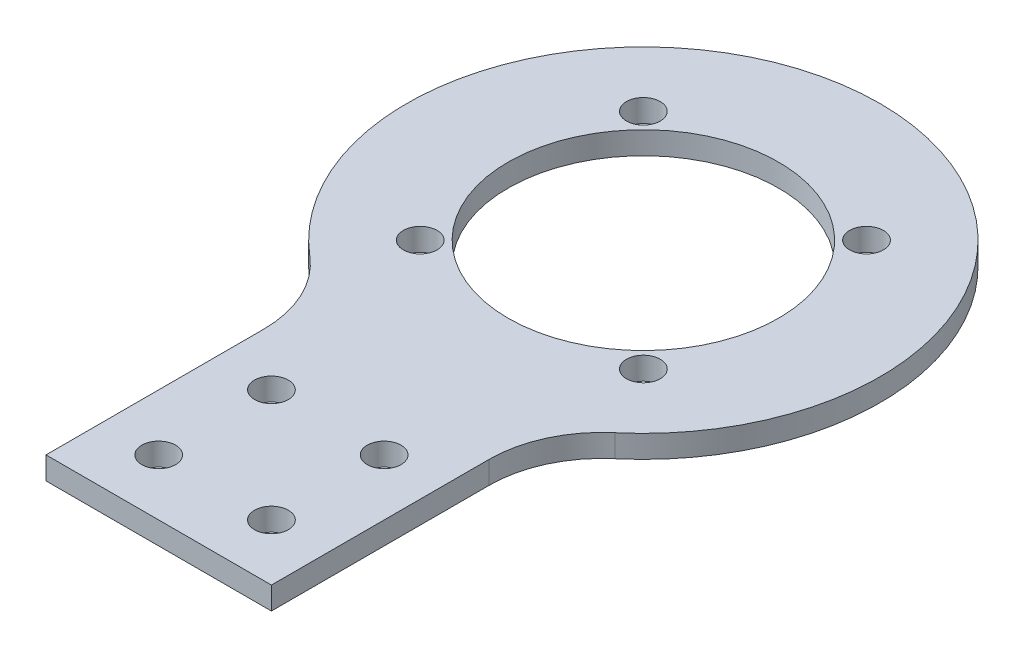
ISO-10303-21;
HEADER;
FILE_DESCRIPTION(('STEP AP214'),'2;1');
FILE_NAME('part.step','',(''),(''),'','','');
FILE_SCHEMA(('AUTOMOTIVE_DESIGN { 1 0 10303 214 1 1 1 1 }'));
ENDSEC;
DATA;
#1=APPLICATION_CONTEXT('core data for automotive mechanical design processes');
#2=APPLICATION_PROTOCOL_DEFINITION('international standard','automotive_design',2000,#1);
#3=PRODUCT_CONTEXT('',#1,'mechanical');
#4=PRODUCT('Part','Part','',(#3));
#5=PRODUCT_RELATED_PRODUCT_CATEGORY('part','',(#4));
#6=PRODUCT_DEFINITION_FORMATION('','',#4);
#7=PRODUCT_DEFINITION_CONTEXT('part definition',#1,'design');
#8=PRODUCT_DEFINITION('design','',#6,#7);
#9=PRODUCT_DEFINITION_SHAPE('','',#8);
#10=(LENGTH_UNIT() NAMED_UNIT(*) SI_UNIT(.MILLI.,.METRE.));
#11=(NAMED_UNIT(*) PLANE_ANGLE_UNIT() SI_UNIT($,.RADIAN.));
#12=(NAMED_UNIT(*) SI_UNIT($,.STERADIAN.) SOLID_ANGLE_UNIT());
#13=UNCERTAINTY_MEASURE_WITH_UNIT(LENGTH_MEASURE(1.E-05),#10,'distance_accuracy_value','');
#14=(GEOMETRIC_REPRESENTATION_CONTEXT(3) GLOBAL_UNCERTAINTY_ASSIGNED_CONTEXT((#13)) GLOBAL_UNIT_ASSIGNED_CONTEXT((#10,
#11,#12)) REPRESENTATION_CONTEXT('',''));
#15=CARTESIAN_POINT('',(0.,0.,0.));
#16=DIRECTION('',(0.,0.,1.));
#17=DIRECTION('',(1.,0.,0.));
#18=AXIS2_PLACEMENT_3D('',#15,#16,#17);
#19=CARTESIAN_POINT('',(0.,2.,0.));
#20=DIRECTION('',(0.,1.,0.));
#21=DIRECTION('',(0.,0.,1.));
#22=AXIS2_PLACEMENT_3D('',#19,#20,#21);
#23=PLANE('',#22);
#24=DIRECTION('',(0.,0.,-1.));
#25=VECTOR('',#24,1.);
#26=CARTESIAN_POINT('',(10.,2.,18.));
#27=LINE('',#26,#25);
#28=CARTESIAN_POINT('',(10.,2.,43.));
#29=VERTEX_POINT('',#28);
#30=CARTESIAN_POINT('',(10.,2.,23.685438564654));
#31=VERTEX_POINT('',#30);
#32=EDGE_CURVE('E104',#29,#31,#27,.T.);
#33=ORIENTED_EDGE('',*,*,#32,.T.);
#34=CARTESIAN_POINT('',(20.,2.,23.685438564654));
#35=DIRECTION('',(0.,1.,0.));
#36=DIRECTION('',(0.,0.,1.));
#37=AXIS2_PLACEMENT_3D('',#34,#35,#36);
#38=CIRCLE('',#37,10.);
#39=CARTESIAN_POINT('',(13.5483870967742,2.,16.0449745115398));
#40=VERTEX_POINT('',#39);
#41=EDGE_CURVE('E200',#31,#40,#38,.F.);
#42=ORIENTED_EDGE('',*,*,#41,.T.);
#43=CARTESIAN_POINT('',(0.,2.,0.));
#44=DIRECTION('',(0.,1.,0.));
#45=DIRECTION('',(0.,0.,1.));
#46=AXIS2_PLACEMENT_3D('',#43,#44,#45);
#47=CIRCLE('',#46,21.);
#48=CARTESIAN_POINT('',(-13.5483870967742,2.,16.0449745115398));
#49=VERTEX_POINT('',#48);
#50=EDGE_CURVE('E178',#40,#49,#47,.T.);
#51=ORIENTED_EDGE('',*,*,#50,.T.);
#52=CARTESIAN_POINT('',(-20.,2.,23.685438564654));
#53=DIRECTION('',(0.,1.,0.));
#54=DIRECTION('',(0.,0.,1.));
#55=AXIS2_PLACEMENT_3D('',#52,#53,#54);
#56=CIRCLE('',#55,10.);
#57=CARTESIAN_POINT('',(-10.,2.,23.685438564654));
#58=VERTEX_POINT('',#57);
#59=EDGE_CURVE('E53',#49,#58,#56,.F.);
#60=ORIENTED_EDGE('',*,*,#59,.T.);
#61=DIRECTION('',(0.,0.,1.));
#62=VECTOR('',#61,1.);
#63=CARTESIAN_POINT('',(-10.,2.,18.));
#64=LINE('',#63,#62);
#65=CARTESIAN_POINT('',(-10.,2.,43.));
#66=VERTEX_POINT('',#65);
#67=EDGE_CURVE('E126',#58,#66,#64,.T.);
#68=ORIENTED_EDGE('',*,*,#67,.T.);
#69=DIRECTION('',(1.,0.,0.));
#70=VECTOR('',#69,1.);
#71=CARTESIAN_POINT('',(-10.,2.,43.));
#72=LINE('',#71,#70);
#73=EDGE_CURVE('E111',#66,#29,#72,.T.);
#74=ORIENTED_EDGE('',*,*,#73,.T.);
#75=EDGE_LOOP('',(#33,#42,#51,#60,#68,#74));
#76=FACE_BOUND('',#75,.T.);
#77=CARTESIAN_POINT('',(-9.89949493661167,2.,9.89949493661167));
#78=DIRECTION('',(0.,1.,0.));
#79=DIRECTION('',(0.,0.,1.));
#80=AXIS2_PLACEMENT_3D('',#77,#78,#79);
#81=CIRCLE('',#80,1.5);
#82=CARTESIAN_POINT('',(-9.89949493661167,2.,11.3994949366117));
#83=VERTEX_POINT('',#82);
#84=EDGE_CURVE('E146',#83,#83,#81,.T.);
#85=ORIENTED_EDGE('',*,*,#84,.F.);
#86=EDGE_LOOP('',(#85));
#87=FACE_BOUND('',#86,.T.);
#88=CARTESIAN_POINT('',(9.89949493661167,2.,-9.89949493661167));
#89=DIRECTION('',(0.,1.,0.));
#90=DIRECTION('',(0.,0.,1.));
#91=AXIS2_PLACEMENT_3D('',#88,#89,#90);
#92=CIRCLE('',#91,1.5);
#93=CARTESIAN_POINT('',(9.89949493661167,2.,-8.39949493661167));
#94=VERTEX_POINT('',#93);
#95=EDGE_CURVE('E162',#94,#94,#92,.T.);
#96=ORIENTED_EDGE('',*,*,#95,.F.);
#97=EDGE_LOOP('',(#96));
#98=FACE_BOUND('',#97,.T.);
#99=CARTESIAN_POINT('',(0.,2.,0.));
#100=DIRECTION('',(0.,1.,0.));
#101=DIRECTION('',(0.,0.,1.));
#102=AXIS2_PLACEMENT_3D('',#99,#100,#101);
#103=CIRCLE('',#102,12.);
#104=CARTESIAN_POINT('',(0.,2.,12.));
#105=VERTEX_POINT('',#104);
#106=EDGE_CURVE('E170',#105,#105,#103,.T.);
#107=ORIENTED_EDGE('',*,*,#106,.F.);
#108=EDGE_LOOP('',(#107));
#109=FACE_BOUND('',#108,.T.);
#110=CARTESIAN_POINT('',(9.89949493661167,2.,9.89949493661167));
#111=DIRECTION('',(0.,1.,0.));
#112=DIRECTION('',(0.,0.,1.));
#113=AXIS2_PLACEMENT_3D('',#110,#111,#112);
#114=CIRCLE('',#113,1.5);
#115=CARTESIAN_POINT('',(9.89949493661167,2.,11.3994949366117));
#116=VERTEX_POINT('',#115);
#117=EDGE_CURVE('E154',#116,#116,#114,.T.);
#118=ORIENTED_EDGE('',*,*,#117,.F.);
#119=EDGE_LOOP('',(#118));
#120=FACE_BOUND('',#119,.T.);
#121=CARTESIAN_POINT('',(-9.89949493661167,2.,-9.89949493661167));
#122=DIRECTION('',(0.,1.,0.));
#123=DIRECTION('',(0.,0.,1.));
#124=AXIS2_PLACEMENT_3D('',#121,#122,#123);
#125=CIRCLE('',#124,1.5);
#126=CARTESIAN_POINT('',(-9.89949493661167,2.,-8.39949493661167));
#127=VERTEX_POINT('',#126);
#128=EDGE_CURVE('E138',#127,#127,#125,.T.);
#129=ORIENTED_EDGE('',*,*,#128,.F.);
#130=EDGE_LOOP('',(#129));
#131=FACE_BOUND('',#130,.T.);
#132=CARTESIAN_POINT('',(5.,2.,28.));
#133=DIRECTION('',(0.,1.,0.));
#134=DIRECTION('',(0.,0.,1.));
#135=AXIS2_PLACEMENT_3D('',#132,#133,#134);
#136=CIRCLE('',#135,1.5);
#137=CARTESIAN_POINT('',(5.,2.,29.5));
#138=VERTEX_POINT('',#137);
#139=EDGE_CURVE('E290',#138,#138,#136,.T.);
#140=ORIENTED_EDGE('',*,*,#139,.F.);
#141=EDGE_LOOP('',(#140));
#142=FACE_BOUND('',#141,.T.);
#143=CARTESIAN_POINT('',(-5.,2.,28.));
#144=DIRECTION('',(0.,1.,0.));
#145=DIRECTION('',(0.,0.,1.));
#146=AXIS2_PLACEMENT_3D('',#143,#144,#145);
#147=CIRCLE('',#146,1.5);
#148=CARTESIAN_POINT('',(-5.,2.,29.5));
#149=VERTEX_POINT('',#148);
#150=EDGE_CURVE('E284',#149,#149,#147,.T.);
#151=ORIENTED_EDGE('',*,*,#150,.F.);
#152=EDGE_LOOP('',(#151));
#153=FACE_BOUND('',#152,.T.);
#154=CARTESIAN_POINT('',(5.,2.,38.));
#155=DIRECTION('',(0.,1.,0.));
#156=DIRECTION('',(0.,0.,1.));
#157=AXIS2_PLACEMENT_3D('',#154,#155,#156);
#158=CIRCLE('',#157,1.5);
#159=CARTESIAN_POINT('',(5.,2.,39.5));
#160=VERTEX_POINT('',#159);
#161=EDGE_CURVE('E278',#160,#160,#158,.T.);
#162=ORIENTED_EDGE('',*,*,#161,.F.);
#163=EDGE_LOOP('',(#162));
#164=FACE_BOUND('',#163,.T.);
#165=CARTESIAN_POINT('',(-5.,2.,38.));
#166=DIRECTION('',(0.,1.,0.));
#167=DIRECTION('',(0.,0.,1.));
#168=AXIS2_PLACEMENT_3D('',#165,#166,#167);
#169=CIRCLE('',#168,1.5);
#170=CARTESIAN_POINT('',(-5.,2.,39.5));
#171=VERTEX_POINT('',#170);
#172=EDGE_CURVE('E273',#171,#171,#169,.T.);
#173=ORIENTED_EDGE('',*,*,#172,.F.);
#174=EDGE_LOOP('',(#173));
#175=FACE_BOUND('',#174,.T.);
#176=ADVANCED_FACE('F44',(#76,#87,#98,#109,#120,#131,#142,#153,#164,#175),#23,.T.);
#177=CARTESIAN_POINT('',(0.,0.,0.));
#178=DIRECTION('',(0.,1.,0.));
#179=DIRECTION('',(0.,0.,1.));
#180=AXIS2_PLACEMENT_3D('',#177,#178,#179);
#181=PLANE('',#180);
#182=CARTESIAN_POINT('',(0.,0.,0.));
#183=DIRECTION('',(0.,1.,0.));
#184=DIRECTION('',(0.,0.,1.));
#185=AXIS2_PLACEMENT_3D('',#182,#183,#184);
#186=CIRCLE('',#185,21.);
#187=CARTESIAN_POINT('',(13.5483870967742,0.,16.0449745115398));
#188=VERTEX_POINT('',#187);
#189=CARTESIAN_POINT('',(-13.5483870967742,0.,16.0449745115398));
#190=VERTEX_POINT('',#189);
#191=EDGE_CURVE('E174',#188,#190,#186,.T.);
#192=ORIENTED_EDGE('',*,*,#191,.F.);
#193=CARTESIAN_POINT('',(20.,0.,23.685438564654));
#194=DIRECTION('',(0.,1.,0.));
#195=DIRECTION('',(0.,0.,1.));
#196=AXIS2_PLACEMENT_3D('',#193,#194,#195);
#197=CIRCLE('',#196,10.);
#198=CARTESIAN_POINT('',(10.,0.,23.685438564654));
#199=VERTEX_POINT('',#198);
#200=EDGE_CURVE('E197',#188,#199,#197,.T.);
#201=ORIENTED_EDGE('',*,*,#200,.T.);
#202=DIRECTION('',(0.,0.,-1.));
#203=VECTOR('',#202,1.);
#204=CARTESIAN_POINT('',(10.,0.,18.));
#205=LINE('',#204,#203);
#206=CARTESIAN_POINT('',(10.,0.,43.));
#207=VERTEX_POINT('',#206);
#208=EDGE_CURVE('E114',#207,#199,#205,.T.);
#209=ORIENTED_EDGE('',*,*,#208,.F.);
#210=DIRECTION('',(1.,0.,0.));
#211=VECTOR('',#210,1.);
#212=CARTESIAN_POINT('',(-10.,0.,43.));
#213=LINE('',#212,#211);
#214=CARTESIAN_POINT('',(-10.,0.,43.));
#215=VERTEX_POINT('',#214);
#216=EDGE_CURVE('E103',#215,#207,#213,.T.);
#217=ORIENTED_EDGE('',*,*,#216,.F.);
#218=DIRECTION('',(0.,0.,1.));
#219=VECTOR('',#218,1.);
#220=CARTESIAN_POINT('',(-10.,0.,18.));
#221=LINE('',#220,#219);
#222=CARTESIAN_POINT('',(-10.,0.,23.685438564654));
#223=VERTEX_POINT('',#222);
#224=EDGE_CURVE('E94',#223,#215,#221,.T.);
#225=ORIENTED_EDGE('',*,*,#224,.F.);
#226=CARTESIAN_POINT('',(-20.,0.,23.685438564654));
#227=DIRECTION('',(0.,1.,0.));
#228=DIRECTION('',(0.,0.,1.));
#229=AXIS2_PLACEMENT_3D('',#226,#227,#228);
#230=CIRCLE('',#229,10.);
#231=EDGE_CURVE('E11',#223,#190,#230,.T.);
#232=ORIENTED_EDGE('',*,*,#231,.T.);
#233=EDGE_LOOP('',(#192,#201,#209,#217,#225,#232));
#234=FACE_BOUND('',#233,.T.);
#235=CARTESIAN_POINT('',(0.,0.,0.));
#236=DIRECTION('',(0.,1.,0.));
#237=DIRECTION('',(0.,0.,1.));
#238=AXIS2_PLACEMENT_3D('',#235,#236,#237);
#239=CIRCLE('',#238,12.);
#240=CARTESIAN_POINT('',(0.,0.,12.));
#241=VERTEX_POINT('',#240);
#242=EDGE_CURVE('E166',#241,#241,#239,.T.);
#243=ORIENTED_EDGE('',*,*,#242,.T.);
#244=EDGE_LOOP('',(#243));
#245=FACE_BOUND('',#244,.T.);
#246=CARTESIAN_POINT('',(9.89949493661167,0.,-9.89949493661167));
#247=DIRECTION('',(0.,1.,0.));
#248=DIRECTION('',(0.,0.,1.));
#249=AXIS2_PLACEMENT_3D('',#246,#247,#248);
#250=CIRCLE('',#249,1.5);
#251=CARTESIAN_POINT('',(9.89949493661167,0.,-8.39949493661167));
#252=VERTEX_POINT('',#251);
#253=EDGE_CURVE('E158',#252,#252,#250,.T.);
#254=ORIENTED_EDGE('',*,*,#253,.T.);
#255=EDGE_LOOP('',(#254));
#256=FACE_BOUND('',#255,.T.);
#257=CARTESIAN_POINT('',(9.89949493661167,0.,9.89949493661167));
#258=DIRECTION('',(0.,1.,0.));
#259=DIRECTION('',(0.,0.,1.));
#260=AXIS2_PLACEMENT_3D('',#257,#258,#259);
#261=CIRCLE('',#260,1.5);
#262=CARTESIAN_POINT('',(9.89949493661167,0.,11.3994949366117));
#263=VERTEX_POINT('',#262);
#264=EDGE_CURVE('E150',#263,#263,#261,.T.);
#265=ORIENTED_EDGE('',*,*,#264,.T.);
#266=EDGE_LOOP('',(#265));
#267=FACE_BOUND('',#266,.T.);
#268=CARTESIAN_POINT('',(-9.89949493661167,0.,9.89949493661167));
#269=DIRECTION('',(0.,1.,0.));
#270=DIRECTION('',(0.,0.,1.));
#271=AXIS2_PLACEMENT_3D('',#268,#269,#270);
#272=CIRCLE('',#271,1.5);
#273=CARTESIAN_POINT('',(-9.89949493661167,0.,11.3994949366117));
#274=VERTEX_POINT('',#273);
#275=EDGE_CURVE('E142',#274,#274,#272,.T.);
#276=ORIENTED_EDGE('',*,*,#275,.T.);
#277=EDGE_LOOP('',(#276));
#278=FACE_BOUND('',#277,.T.);
#279=CARTESIAN_POINT('',(-9.89949493661167,0.,-9.89949493661167));
#280=DIRECTION('',(0.,1.,0.));
#281=DIRECTION('',(0.,0.,1.));
#282=AXIS2_PLACEMENT_3D('',#279,#280,#281);
#283=CIRCLE('',#282,1.5);
#284=CARTESIAN_POINT('',(-9.89949493661167,0.,-8.39949493661167));
#285=VERTEX_POINT('',#284);
#286=EDGE_CURVE('E136',#285,#285,#283,.T.);
#287=ORIENTED_EDGE('',*,*,#286,.T.);
#288=EDGE_LOOP('',(#287));
#289=FACE_BOUND('',#288,.T.);
#290=CARTESIAN_POINT('',(5.,0.,28.));
#291=DIRECTION('',(0.,1.,0.));
#292=DIRECTION('',(0.,0.,1.));
#293=AXIS2_PLACEMENT_3D('',#290,#291,#292);
#294=CIRCLE('',#293,1.5);
#295=CARTESIAN_POINT('',(5.,0.,29.5));
#296=VERTEX_POINT('',#295);
#297=EDGE_CURVE('E260',#296,#296,#294,.T.);
#298=ORIENTED_EDGE('',*,*,#297,.T.);
#299=EDGE_LOOP('',(#298));
#300=FACE_BOUND('',#299,.T.);
#301=CARTESIAN_POINT('',(-5.,0.,28.));
#302=DIRECTION('',(0.,1.,0.));
#303=DIRECTION('',(0.,0.,1.));
#304=AXIS2_PLACEMENT_3D('',#301,#302,#303);
#305=CIRCLE('',#304,1.5);
#306=CARTESIAN_POINT('',(-5.,0.,29.5));
#307=VERTEX_POINT('',#306);
#308=EDGE_CURVE('E264',#307,#307,#305,.T.);
#309=ORIENTED_EDGE('',*,*,#308,.T.);
#310=EDGE_LOOP('',(#309));
#311=FACE_BOUND('',#310,.T.);
#312=CARTESIAN_POINT('',(5.,0.,38.));
#313=DIRECTION('',(0.,1.,0.));
#314=DIRECTION('',(0.,0.,1.));
#315=AXIS2_PLACEMENT_3D('',#312,#313,#314);
#316=CIRCLE('',#315,1.5);
#317=CARTESIAN_POINT('',(5.,0.,39.5));
#318=VERTEX_POINT('',#317);
#319=EDGE_CURVE('E268',#318,#318,#316,.T.);
#320=ORIENTED_EDGE('',*,*,#319,.T.);
#321=EDGE_LOOP('',(#320));
#322=FACE_BOUND('',#321,.T.);
#323=CARTESIAN_POINT('',(-5.,0.,38.));
#324=DIRECTION('',(0.,1.,0.));
#325=DIRECTION('',(0.,0.,1.));
#326=AXIS2_PLACEMENT_3D('',#323,#324,#325);
#327=CIRCLE('',#326,1.5);
#328=CARTESIAN_POINT('',(-5.,0.,39.5));
#329=VERTEX_POINT('',#328);
#330=EDGE_CURVE('E129',#329,#329,#327,.T.);
#331=ORIENTED_EDGE('',*,*,#330,.T.);
#332=EDGE_LOOP('',(#331));
#333=FACE_BOUND('',#332,.T.);
#334=ADVANCED_FACE('F117',(#234,#245,#256,#267,#278,#289,#300,#311,#322,#333),#181,.F.);
#335=CARTESIAN_POINT('',(0.,2.,0.));
#336=DIRECTION('',(0.,-1.,0.));
#337=DIRECTION('',(0.,0.,-1.));
#338=AXIS2_PLACEMENT_3D('',#335,#336,#337);
#339=CYLINDRICAL_SURFACE('',#338,21.);
#340=ORIENTED_EDGE('',*,*,#50,.F.);
#341=DIRECTION('',(0.,-1.,0.));
#342=VECTOR('',#341,1.);
#343=CARTESIAN_POINT('',(13.5483870967742,2.,16.0449745115398));
#344=LINE('',#343,#342);
#345=EDGE_CURVE('E188',#40,#188,#344,.T.);
#346=ORIENTED_EDGE('',*,*,#345,.T.);
#347=ORIENTED_EDGE('',*,*,#191,.T.);
#348=DIRECTION('',(0.,-1.,0.));
#349=VECTOR('',#348,1.);
#350=CARTESIAN_POINT('',(-13.5483870967742,2.,16.0449745115398));
#351=LINE('',#350,#349);
#352=EDGE_CURVE('E181',#190,#49,#351,.F.);
#353=ORIENTED_EDGE('',*,*,#352,.T.);
#354=EDGE_LOOP('',(#340,#346,#347,#353));
#355=FACE_BOUND('',#354,.T.);
#356=ADVANCED_FACE('F211',(#355),#339,.T.);
#357=CARTESIAN_POINT('',(0.,2.,0.));
#358=DIRECTION('',(0.,-1.,0.));
#359=DIRECTION('',(0.,0.,-1.));
#360=AXIS2_PLACEMENT_3D('',#357,#358,#359);
#361=CYLINDRICAL_SURFACE('',#360,12.);
#362=ORIENTED_EDGE('',*,*,#106,.T.);
#363=EDGE_LOOP('',(#362));
#364=FACE_BOUND('',#363,.T.);
#365=ORIENTED_EDGE('',*,*,#242,.F.);
#366=EDGE_LOOP('',(#365));
#367=FACE_BOUND('',#366,.T.);
#368=ADVANCED_FACE('F230',(#364,#367),#361,.F.);
#369=CARTESIAN_POINT('',(9.89949493661167,2.,-9.89949493661167));
#370=DIRECTION('',(0.,-1.,0.));
#371=DIRECTION('',(0.,0.,-1.));
#372=AXIS2_PLACEMENT_3D('',#369,#370,#371);
#373=CYLINDRICAL_SURFACE('',#372,1.5);
#374=ORIENTED_EDGE('',*,*,#95,.T.);
#375=EDGE_LOOP('',(#374));
#376=FACE_BOUND('',#375,.T.);
#377=ORIENTED_EDGE('',*,*,#253,.F.);
#378=EDGE_LOOP('',(#377));
#379=FACE_BOUND('',#378,.T.);
#380=ADVANCED_FACE('F238',(#376,#379),#373,.F.);
#381=CARTESIAN_POINT('',(9.89949493661167,2.,9.89949493661167));
#382=DIRECTION('',(0.,-1.,0.));
#383=DIRECTION('',(0.,0.,-1.));
#384=AXIS2_PLACEMENT_3D('',#381,#382,#383);
#385=CYLINDRICAL_SURFACE('',#384,1.5);
#386=ORIENTED_EDGE('',*,*,#117,.T.);
#387=EDGE_LOOP('',(#386));
#388=FACE_BOUND('',#387,.T.);
#389=ORIENTED_EDGE('',*,*,#264,.F.);
#390=EDGE_LOOP('',(#389));
#391=FACE_BOUND('',#390,.T.);
#392=ADVANCED_FACE('F243',(#388,#391),#385,.F.);
#393=CARTESIAN_POINT('',(-9.89949493661167,2.,9.89949493661167));
#394=DIRECTION('',(0.,-1.,0.));
#395=DIRECTION('',(0.,0.,-1.));
#396=AXIS2_PLACEMENT_3D('',#393,#394,#395);
#397=CYLINDRICAL_SURFACE('',#396,1.5);
#398=ORIENTED_EDGE('',*,*,#84,.T.);
#399=EDGE_LOOP('',(#398));
#400=FACE_BOUND('',#399,.T.);
#401=ORIENTED_EDGE('',*,*,#275,.F.);
#402=EDGE_LOOP('',(#401));
#403=FACE_BOUND('',#402,.T.);
#404=ADVANCED_FACE('F325',(#400,#403),#397,.F.);
#405=CARTESIAN_POINT('',(-9.89949493661167,2.,-9.89949493661167));
#406=DIRECTION('',(0.,-1.,0.));
#407=DIRECTION('',(0.,0.,-1.));
#408=AXIS2_PLACEMENT_3D('',#405,#406,#407);
#409=CYLINDRICAL_SURFACE('',#408,1.5);
#410=ORIENTED_EDGE('',*,*,#128,.T.);
#411=EDGE_LOOP('',(#410));
#412=FACE_BOUND('',#411,.T.);
#413=ORIENTED_EDGE('',*,*,#286,.F.);
#414=EDGE_LOOP('',(#413));
#415=FACE_BOUND('',#414,.T.);
#416=ADVANCED_FACE('F319',(#412,#415),#409,.F.);
#417=CARTESIAN_POINT('',(10.,0.,18.));
#418=DIRECTION('',(1.,0.,0.));
#419=DIRECTION('',(0.,0.,-1.));
#420=AXIS2_PLACEMENT_3D('',#417,#418,#419);
#421=PLANE('',#420);
#422=ORIENTED_EDGE('',*,*,#208,.T.);
#423=DIRECTION('',(0.,-1.,0.));
#424=VECTOR('',#423,1.);
#425=CARTESIAN_POINT('',(10.,0.,23.685438564654));
#426=LINE('',#425,#424);
#427=EDGE_CURVE('E192',#199,#31,#426,.F.);
#428=ORIENTED_EDGE('',*,*,#427,.T.);
#429=ORIENTED_EDGE('',*,*,#32,.F.);
#430=DIRECTION('',(0.,1.,0.));
#431=VECTOR('',#430,1.);
#432=CARTESIAN_POINT('',(10.,0.,43.));
#433=LINE('',#432,#431);
#434=EDGE_CURVE('E113',#207,#29,#433,.T.);
#435=ORIENTED_EDGE('',*,*,#434,.F.);
#436=EDGE_LOOP('',(#422,#428,#429,#435));
#437=FACE_BOUND('',#436,.T.);
#438=ADVANCED_FACE('F215',(#437),#421,.T.);
#439=CARTESIAN_POINT('',(-10.,0.,18.));
#440=DIRECTION('',(-1.,0.,0.));
#441=DIRECTION('',(0.,0.,1.));
#442=AXIS2_PLACEMENT_3D('',#439,#440,#441);
#443=PLANE('',#442);
#444=ORIENTED_EDGE('',*,*,#67,.F.);
#445=DIRECTION('',(0.,-1.,0.));
#446=VECTOR('',#445,1.);
#447=CARTESIAN_POINT('',(-10.,0.,23.685438564654));
#448=LINE('',#447,#446);
#449=EDGE_CURVE('E66',#58,#223,#448,.T.);
#450=ORIENTED_EDGE('',*,*,#449,.T.);
#451=ORIENTED_EDGE('',*,*,#224,.T.);
#452=DIRECTION('',(0.,1.,0.));
#453=VECTOR('',#452,1.);
#454=CARTESIAN_POINT('',(-10.,0.,43.));
#455=LINE('',#454,#453);
#456=EDGE_CURVE('E97',#215,#66,#455,.T.);
#457=ORIENTED_EDGE('',*,*,#456,.T.);
#458=EDGE_LOOP('',(#444,#450,#451,#457));
#459=FACE_BOUND('',#458,.T.);
#460=ADVANCED_FACE('F96',(#459),#443,.T.);
#461=CARTESIAN_POINT('',(-10.,0.,43.));
#462=DIRECTION('',(0.,0.,1.));
#463=DIRECTION('',(1.,0.,0.));
#464=AXIS2_PLACEMENT_3D('',#461,#462,#463);
#465=PLANE('',#464);
#466=ORIENTED_EDGE('',*,*,#73,.F.);
#467=ORIENTED_EDGE('',*,*,#456,.F.);
#468=ORIENTED_EDGE('',*,*,#216,.T.);
#469=ORIENTED_EDGE('',*,*,#434,.T.);
#470=EDGE_LOOP('',(#466,#467,#468,#469));
#471=FACE_BOUND('',#470,.T.);
#472=ADVANCED_FACE('F108',(#471),#465,.T.);
#473=CARTESIAN_POINT('',(-5.,0.,38.));
#474=DIRECTION('',(0.,1.,0.));
#475=DIRECTION('',(0.,0.,1.));
#476=AXIS2_PLACEMENT_3D('',#473,#474,#475);
#477=CYLINDRICAL_SURFACE('',#476,1.5);
#478=ORIENTED_EDGE('',*,*,#330,.F.);
#479=EDGE_LOOP('',(#478));
#480=FACE_BOUND('',#479,.T.);
#481=ORIENTED_EDGE('',*,*,#172,.T.);
#482=EDGE_LOOP('',(#481));
#483=FACE_BOUND('',#482,.T.);
#484=ADVANCED_FACE('F305',(#480,#483),#477,.F.);
#485=CARTESIAN_POINT('',(5.,0.,38.));
#486=DIRECTION('',(0.,1.,0.));
#487=DIRECTION('',(0.,0.,1.));
#488=AXIS2_PLACEMENT_3D('',#485,#486,#487);
#489=CYLINDRICAL_SURFACE('',#488,1.5);
#490=ORIENTED_EDGE('',*,*,#319,.F.);
#491=EDGE_LOOP('',(#490));
#492=FACE_BOUND('',#491,.T.);
#493=ORIENTED_EDGE('',*,*,#161,.T.);
#494=EDGE_LOOP('',(#493));
#495=FACE_BOUND('',#494,.T.);
#496=ADVANCED_FACE('F307',(#492,#495),#489,.F.);
#497=CARTESIAN_POINT('',(-5.,0.,28.));
#498=DIRECTION('',(0.,1.,0.));
#499=DIRECTION('',(0.,0.,1.));
#500=AXIS2_PLACEMENT_3D('',#497,#498,#499);
#501=CYLINDRICAL_SURFACE('',#500,1.5);
#502=ORIENTED_EDGE('',*,*,#308,.F.);
#503=EDGE_LOOP('',(#502));
#504=FACE_BOUND('',#503,.T.);
#505=ORIENTED_EDGE('',*,*,#150,.T.);
#506=EDGE_LOOP('',(#505));
#507=FACE_BOUND('',#506,.T.);
#508=ADVANCED_FACE('F313',(#504,#507),#501,.F.);
#509=CARTESIAN_POINT('',(5.,0.,28.));
#510=DIRECTION('',(0.,1.,0.));
#511=DIRECTION('',(0.,0.,1.));
#512=AXIS2_PLACEMENT_3D('',#509,#510,#511);
#513=CYLINDRICAL_SURFACE('',#512,1.5);
#514=ORIENTED_EDGE('',*,*,#297,.F.);
#515=EDGE_LOOP('',(#514));
#516=FACE_BOUND('',#515,.T.);
#517=ORIENTED_EDGE('',*,*,#139,.T.);
#518=EDGE_LOOP('',(#517));
#519=FACE_BOUND('',#518,.T.);
#520=ADVANCED_FACE('F221',(#516,#519),#513,.F.);
#521=CARTESIAN_POINT('',(20.,2.,23.685438564654));
#522=DIRECTION('',(0.,-1.,0.));
#523=DIRECTION('',(0.,0.,-1.));
#524=AXIS2_PLACEMENT_3D('',#521,#522,#523);
#525=CYLINDRICAL_SURFACE('',#524,10.);
#526=ORIENTED_EDGE('',*,*,#41,.F.);
#527=ORIENTED_EDGE('',*,*,#427,.F.);
#528=ORIENTED_EDGE('',*,*,#200,.F.);
#529=ORIENTED_EDGE('',*,*,#345,.F.);
#530=EDGE_LOOP('',(#526,#527,#528,#529));
#531=FACE_BOUND('',#530,.T.);
#532=ADVANCED_FACE('F213',(#531),#525,.F.);
#533=CARTESIAN_POINT('',(-20.,2.,23.685438564654));
#534=DIRECTION('',(0.,-1.,0.));
#535=DIRECTION('',(0.,0.,-1.));
#536=AXIS2_PLACEMENT_3D('',#533,#534,#535);
#537=CYLINDRICAL_SURFACE('',#536,10.);
#538=ORIENTED_EDGE('',*,*,#231,.F.);
#539=ORIENTED_EDGE('',*,*,#449,.F.);
#540=ORIENTED_EDGE('',*,*,#59,.F.);
#541=ORIENTED_EDGE('',*,*,#352,.F.);
#542=EDGE_LOOP('',(#538,#539,#540,#541));
#543=FACE_BOUND('',#542,.T.);
#544=ADVANCED_FACE('F46',(#543),#537,.F.);
#545=CLOSED_SHELL('',(#176,#334,#356,#368,#380,#392,#404,#416,#438,#460,#472,#484,#496,#508,
#520,#532,#544));
#546=MANIFOLD_SOLID_BREP('B2',#545);
#547=ADVANCED_BREP_SHAPE_REPRESENTATION('',(#18,#546),#14);
#548=SHAPE_DEFINITION_REPRESENTATION(#9,#547);
ENDSEC;
END-ISO-10303-21;
